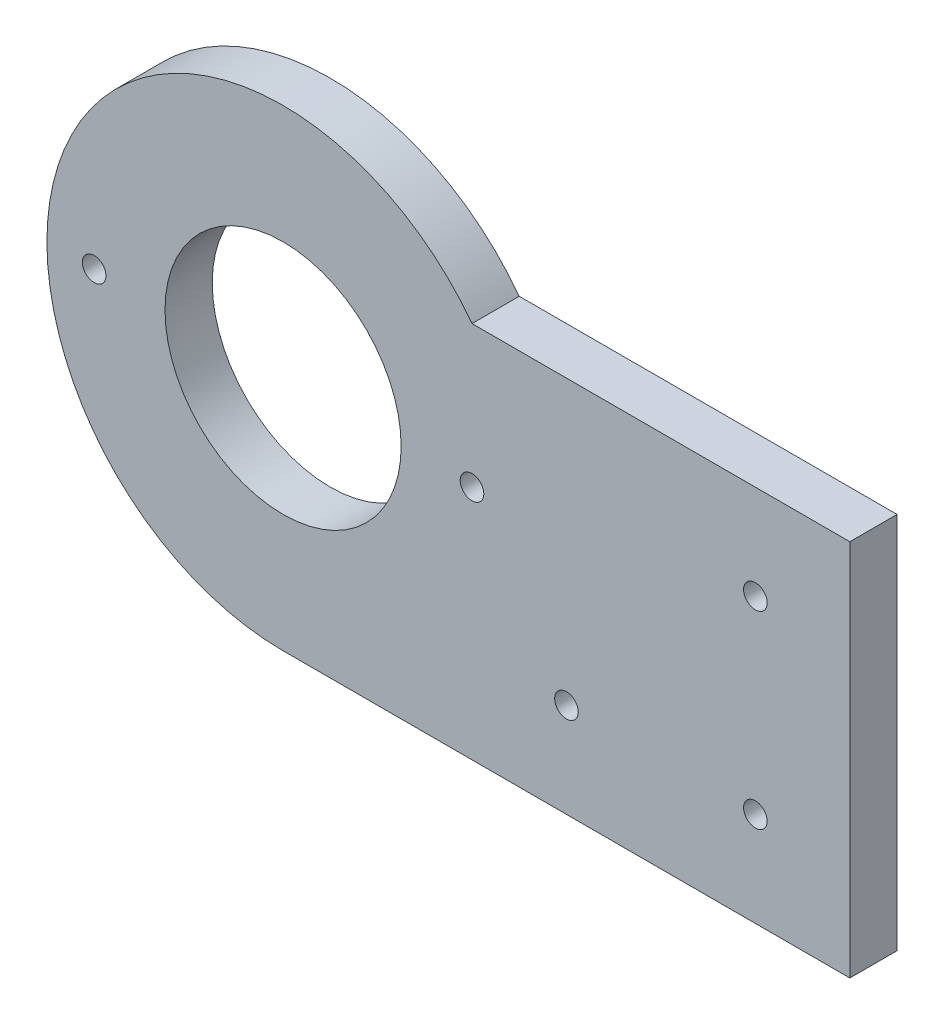
ISO-10303-21;
HEADER;
FILE_DESCRIPTION(('STEP AP214'),'2;1');
FILE_NAME('part.step','',(''),(''),'','','');
FILE_SCHEMA(('AUTOMOTIVE_DESIGN { 1 0 10303 214 1 1 1 1 }'));
ENDSEC;
DATA;
#1=APPLICATION_CONTEXT('core data for automotive mechanical design processes');
#2=APPLICATION_PROTOCOL_DEFINITION('international standard','automotive_design',2000,#1);
#3=PRODUCT_CONTEXT('',#1,'mechanical');
#4=PRODUCT('Part','Part','',(#3));
#5=PRODUCT_RELATED_PRODUCT_CATEGORY('part','',(#4));
#6=PRODUCT_DEFINITION_FORMATION('','',#4);
#7=PRODUCT_DEFINITION_CONTEXT('part definition',#1,'design');
#8=PRODUCT_DEFINITION('design','',#6,#7);
#9=PRODUCT_DEFINITION_SHAPE('','',#8);
#10=(LENGTH_UNIT() NAMED_UNIT(*) SI_UNIT(.MILLI.,.METRE.));
#11=(NAMED_UNIT(*) PLANE_ANGLE_UNIT() SI_UNIT($,.RADIAN.));
#12=(NAMED_UNIT(*) SI_UNIT($,.STERADIAN.) SOLID_ANGLE_UNIT());
#13=UNCERTAINTY_MEASURE_WITH_UNIT(LENGTH_MEASURE(1.E-05),#10,'distance_accuracy_value','');
#14=(GEOMETRIC_REPRESENTATION_CONTEXT(3) GLOBAL_UNCERTAINTY_ASSIGNED_CONTEXT((#13)) GLOBAL_UNIT_ASSIGNED_CONTEXT((#10,
#11,#12)) REPRESENTATION_CONTEXT('',''));
#15=CARTESIAN_POINT('',(0.,0.,0.));
#16=DIRECTION('',(0.,0.,1.));
#17=DIRECTION('',(1.,0.,0.));
#18=AXIS2_PLACEMENT_3D('',#15,#16,#17);
#19=CARTESIAN_POINT('',(0.,0.,6.35));
#20=DIRECTION('',(0.,0.,-1.));
#21=DIRECTION('',(-1.,0.,0.));
#22=AXIS2_PLACEMENT_3D('',#19,#20,#21);
#23=PLANE('',#22);
#24=DIRECTION('',(-1.,0.,0.));
#25=VECTOR('',#24,1.);
#26=CARTESIAN_POINT('',(76.2,19.05,6.35));
#27=LINE('',#26,#25);
#28=CARTESIAN_POINT('',(76.2,19.05,6.35));
#29=VERTEX_POINT('',#28);
#30=CARTESIAN_POINT('',(25.4,19.05,6.35));
#31=VERTEX_POINT('',#30);
#32=EDGE_CURVE('E103',#29,#31,#27,.T.);
#33=ORIENTED_EDGE('',*,*,#32,.T.);
#34=CARTESIAN_POINT('',(0.,0.,6.35));
#35=DIRECTION('',(0.,0.,1.));
#36=DIRECTION('',(-1.,0.,0.));
#37=AXIS2_PLACEMENT_3D('',#34,#35,#36);
#38=CIRCLE('',#37,31.75);
#39=CARTESIAN_POINT('',(0.,-31.75,6.35));
#40=VERTEX_POINT('',#39);
#41=EDGE_CURVE('E55',#31,#40,#38,.T.);
#42=ORIENTED_EDGE('',*,*,#41,.T.);
#43=DIRECTION('',(1.,0.,0.));
#44=VECTOR('',#43,1.);
#45=CARTESIAN_POINT('',(0.,-31.75,6.35));
#46=LINE('',#45,#44);
#47=CARTESIAN_POINT('',(76.2,-31.75,6.35));
#48=VERTEX_POINT('',#47);
#49=EDGE_CURVE('E156',#40,#48,#46,.T.);
#50=ORIENTED_EDGE('',*,*,#49,.T.);
#51=DIRECTION('',(0.,1.,0.));
#52=VECTOR('',#51,1.);
#53=CARTESIAN_POINT('',(76.2,-31.75,6.35));
#54=LINE('',#53,#52);
#55=EDGE_CURVE('E159',#48,#29,#54,.T.);
#56=ORIENTED_EDGE('',*,*,#55,.T.);
#57=EDGE_LOOP('',(#33,#42,#50,#56));
#58=FACE_BOUND('',#57,.T.);
#59=CARTESIAN_POINT('',(0.,0.,6.35));
#60=DIRECTION('',(0.,0.,1.));
#61=DIRECTION('',(1.,0.,0.));
#62=AXIS2_PLACEMENT_3D('',#59,#60,#61);
#63=CIRCLE('',#62,15.875);
#64=CARTESIAN_POINT('',(15.875,0.,6.35));
#65=VERTEX_POINT('',#64);
#66=EDGE_CURVE('E147',#65,#65,#63,.T.);
#67=ORIENTED_EDGE('',*,*,#66,.F.);
#68=EDGE_LOOP('',(#67));
#69=FACE_BOUND('',#68,.T.);
#70=CARTESIAN_POINT('',(-25.4,0.,6.35));
#71=DIRECTION('',(0.,0.,1.));
#72=DIRECTION('',(1.,0.,0.));
#73=AXIS2_PLACEMENT_3D('',#70,#71,#72);
#74=CIRCLE('',#73,1.5875);
#75=CARTESIAN_POINT('',(-23.8125,0.,6.35));
#76=VERTEX_POINT('',#75);
#77=EDGE_CURVE('E139',#76,#76,#74,.T.);
#78=ORIENTED_EDGE('',*,*,#77,.F.);
#79=EDGE_LOOP('',(#78));
#80=FACE_BOUND('',#79,.T.);
#81=CARTESIAN_POINT('',(25.4,0.,6.35));
#82=DIRECTION('',(0.,0.,1.));
#83=DIRECTION('',(1.,0.,0.));
#84=AXIS2_PLACEMENT_3D('',#81,#82,#83);
#85=CIRCLE('',#84,1.5875);
#86=CARTESIAN_POINT('',(26.9875,0.,6.35));
#87=VERTEX_POINT('',#86);
#88=EDGE_CURVE('E131',#87,#87,#85,.T.);
#89=ORIENTED_EDGE('',*,*,#88,.F.);
#90=EDGE_LOOP('',(#89));
#91=FACE_BOUND('',#90,.T.);
#92=CARTESIAN_POINT('',(38.1,-19.05,6.35));
#93=DIRECTION('',(0.,0.,1.));
#94=DIRECTION('',(1.,0.,0.));
#95=AXIS2_PLACEMENT_3D('',#92,#93,#94);
#96=CIRCLE('',#95,1.5875);
#97=CARTESIAN_POINT('',(39.6875,-19.05,6.35));
#98=VERTEX_POINT('',#97);
#99=EDGE_CURVE('E123',#98,#98,#96,.T.);
#100=ORIENTED_EDGE('',*,*,#99,.F.);
#101=EDGE_LOOP('',(#100));
#102=FACE_BOUND('',#101,.T.);
#103=CARTESIAN_POINT('',(63.5,-19.05,6.35));
#104=DIRECTION('',(0.,0.,1.));
#105=DIRECTION('',(1.,0.,0.));
#106=AXIS2_PLACEMENT_3D('',#103,#104,#105);
#107=CIRCLE('',#106,1.5875);
#108=CARTESIAN_POINT('',(65.0875,-19.05,6.35));
#109=VERTEX_POINT('',#108);
#110=EDGE_CURVE('E113',#109,#109,#107,.T.);
#111=ORIENTED_EDGE('',*,*,#110,.F.);
#112=EDGE_LOOP('',(#111));
#113=FACE_BOUND('',#112,.T.);
#114=CARTESIAN_POINT('',(63.5,6.35,6.35));
#115=DIRECTION('',(0.,0.,1.));
#116=DIRECTION('',(1.,0.,0.));
#117=AXIS2_PLACEMENT_3D('',#114,#115,#116);
#118=CIRCLE('',#117,1.5875);
#119=CARTESIAN_POINT('',(65.0875,6.35,6.35));
#120=VERTEX_POINT('',#119);
#121=EDGE_CURVE('E105',#120,#120,#118,.T.);
#122=ORIENTED_EDGE('',*,*,#121,.F.);
#123=EDGE_LOOP('',(#122));
#124=FACE_BOUND('',#123,.T.);
#125=ADVANCED_FACE('F39',(#58,#69,#80,#91,#102,#113,#124),#23,.F.);
#126=CARTESIAN_POINT('',(0.,0.,0.));
#127=DIRECTION('',(0.,0.,-1.));
#128=DIRECTION('',(-1.,0.,0.));
#129=AXIS2_PLACEMENT_3D('',#126,#127,#128);
#130=PLANE('',#129);
#131=CARTESIAN_POINT('',(0.,0.,0.));
#132=DIRECTION('',(0.,0.,1.));
#133=DIRECTION('',(-1.,0.,0.));
#134=AXIS2_PLACEMENT_3D('',#131,#132,#133);
#135=CIRCLE('',#134,31.75);
#136=CARTESIAN_POINT('',(25.4,19.05,0.));
#137=VERTEX_POINT('',#136);
#138=CARTESIAN_POINT('',(0.,-31.75,0.));
#139=VERTEX_POINT('',#138);
#140=EDGE_CURVE('E97',#137,#139,#135,.T.);
#141=ORIENTED_EDGE('',*,*,#140,.F.);
#142=DIRECTION('',(-1.,0.,0.));
#143=VECTOR('',#142,1.);
#144=CARTESIAN_POINT('',(76.2,19.05,0.));
#145=LINE('',#144,#143);
#146=CARTESIAN_POINT('',(76.2,19.05,0.));
#147=VERTEX_POINT('',#146);
#148=EDGE_CURVE('E94',#147,#137,#145,.T.);
#149=ORIENTED_EDGE('',*,*,#148,.F.);
#150=DIRECTION('',(0.,1.,0.));
#151=VECTOR('',#150,1.);
#152=CARTESIAN_POINT('',(76.2,-31.75,0.));
#153=LINE('',#152,#151);
#154=CARTESIAN_POINT('',(76.2,-31.75,0.));
#155=VERTEX_POINT('',#154);
#156=EDGE_CURVE('E80',#155,#147,#153,.T.);
#157=ORIENTED_EDGE('',*,*,#156,.F.);
#158=DIRECTION('',(1.,0.,0.));
#159=VECTOR('',#158,1.);
#160=CARTESIAN_POINT('',(0.,-31.75,0.));
#161=LINE('',#160,#159);
#162=EDGE_CURVE('E91',#139,#155,#161,.T.);
#163=ORIENTED_EDGE('',*,*,#162,.F.);
#164=EDGE_LOOP('',(#141,#149,#157,#163));
#165=FACE_BOUND('',#164,.T.);
#166=CARTESIAN_POINT('',(38.1,-19.05,0.));
#167=DIRECTION('',(0.,0.,1.));
#168=DIRECTION('',(1.,0.,0.));
#169=AXIS2_PLACEMENT_3D('',#166,#167,#168);
#170=CIRCLE('',#169,1.5875);
#171=CARTESIAN_POINT('',(39.6875,-19.05,0.));
#172=VERTEX_POINT('',#171);
#173=EDGE_CURVE('E117',#172,#172,#170,.T.);
#174=ORIENTED_EDGE('',*,*,#173,.T.);
#175=EDGE_LOOP('',(#174));
#176=FACE_BOUND('',#175,.T.);
#177=CARTESIAN_POINT('',(-25.4,0.,0.));
#178=DIRECTION('',(0.,0.,1.));
#179=DIRECTION('',(1.,0.,0.));
#180=AXIS2_PLACEMENT_3D('',#177,#178,#179);
#181=CIRCLE('',#180,1.5875);
#182=CARTESIAN_POINT('',(-23.8125,0.,0.));
#183=VERTEX_POINT('',#182);
#184=EDGE_CURVE('E135',#183,#183,#181,.T.);
#185=ORIENTED_EDGE('',*,*,#184,.T.);
#186=EDGE_LOOP('',(#185));
#187=FACE_BOUND('',#186,.T.);
#188=CARTESIAN_POINT('',(0.,0.,0.));
#189=DIRECTION('',(0.,0.,1.));
#190=DIRECTION('',(1.,0.,0.));
#191=AXIS2_PLACEMENT_3D('',#188,#189,#190);
#192=CIRCLE('',#191,15.875);
#193=CARTESIAN_POINT('',(15.875,0.,0.));
#194=VERTEX_POINT('',#193);
#195=EDGE_CURVE('E143',#194,#194,#192,.T.);
#196=ORIENTED_EDGE('',*,*,#195,.T.);
#197=EDGE_LOOP('',(#196));
#198=FACE_BOUND('',#197,.T.);
#199=CARTESIAN_POINT('',(25.4,0.,0.));
#200=DIRECTION('',(0.,0.,1.));
#201=DIRECTION('',(1.,0.,0.));
#202=AXIS2_PLACEMENT_3D('',#199,#200,#201);
#203=CIRCLE('',#202,1.5875);
#204=CARTESIAN_POINT('',(26.9875,0.,0.));
#205=VERTEX_POINT('',#204);
#206=EDGE_CURVE('E127',#205,#205,#203,.T.);
#207=ORIENTED_EDGE('',*,*,#206,.T.);
#208=EDGE_LOOP('',(#207));
#209=FACE_BOUND('',#208,.T.);
#210=CARTESIAN_POINT('',(63.5,-19.05,0.));
#211=DIRECTION('',(0.,0.,1.));
#212=DIRECTION('',(1.,0.,0.));
#213=AXIS2_PLACEMENT_3D('',#210,#211,#212);
#214=CIRCLE('',#213,1.5875);
#215=CARTESIAN_POINT('',(65.0875,-19.05,0.));
#216=VERTEX_POINT('',#215);
#217=EDGE_CURVE('E118',#216,#216,#214,.T.);
#218=ORIENTED_EDGE('',*,*,#217,.T.);
#219=EDGE_LOOP('',(#218));
#220=FACE_BOUND('',#219,.T.);
#221=CARTESIAN_POINT('',(63.5,6.35,0.));
#222=DIRECTION('',(0.,0.,-1.));
#223=DIRECTION('',(-1.,0.,0.));
#224=AXIS2_PLACEMENT_3D('',#221,#222,#223);
#225=CIRCLE('',#224,1.5875);
#226=CARTESIAN_POINT('',(61.9125,6.35,0.));
#227=VERTEX_POINT('',#226);
#228=EDGE_CURVE('E122',#227,#227,#225,.F.);
#229=ORIENTED_EDGE('',*,*,#228,.T.);
#230=EDGE_LOOP('',(#229));
#231=FACE_BOUND('',#230,.T.);
#232=ADVANCED_FACE('F95',(#165,#176,#187,#198,#209,#220,#231),#130,.T.);
#233=CARTESIAN_POINT('',(0.,0.,6.35));
#234=DIRECTION('',(0.,0.,-1.));
#235=DIRECTION('',(-1.,0.,0.));
#236=AXIS2_PLACEMENT_3D('',#233,#234,#235);
#237=CYLINDRICAL_SURFACE('',#236,31.75);
#238=ORIENTED_EDGE('',*,*,#41,.F.);
#239=DIRECTION('',(0.,0.,1.));
#240=VECTOR('',#239,1.);
#241=CARTESIAN_POINT('',(25.4,19.05,-56.7961266284947));
#242=LINE('',#241,#240);
#243=EDGE_CURVE('E59',#137,#31,#242,.T.);
#244=ORIENTED_EDGE('',*,*,#243,.F.);
#245=ORIENTED_EDGE('',*,*,#140,.T.);
#246=DIRECTION('',(0.,0.,-1.));
#247=VECTOR('',#246,1.);
#248=CARTESIAN_POINT('',(0.,-31.75,6.35));
#249=LINE('',#248,#247);
#250=EDGE_CURVE('E11',#40,#139,#249,.T.);
#251=ORIENTED_EDGE('',*,*,#250,.F.);
#252=EDGE_LOOP('',(#238,#244,#245,#251));
#253=FACE_BOUND('',#252,.T.);
#254=ADVANCED_FACE('F41',(#253),#237,.T.);
#255=CARTESIAN_POINT('',(0.,-31.75,6.35));
#256=DIRECTION('',(0.,1.,0.));
#257=DIRECTION('',(0.,0.,1.));
#258=AXIS2_PLACEMENT_3D('',#255,#256,#257);
#259=PLANE('',#258);
#260=ORIENTED_EDGE('',*,*,#162,.T.);
#261=DIRECTION('',(0.,0.,-1.));
#262=VECTOR('',#261,1.);
#263=CARTESIAN_POINT('',(76.2,-31.75,6.35));
#264=LINE('',#263,#262);
#265=EDGE_CURVE('E48',#48,#155,#264,.T.);
#266=ORIENTED_EDGE('',*,*,#265,.F.);
#267=ORIENTED_EDGE('',*,*,#49,.F.);
#268=ORIENTED_EDGE('',*,*,#250,.T.);
#269=EDGE_LOOP('',(#260,#266,#267,#268));
#270=FACE_BOUND('',#269,.T.);
#271=ADVANCED_FACE('F175',(#270),#259,.F.);
#272=CARTESIAN_POINT('',(76.2,-31.75,6.35));
#273=DIRECTION('',(-1.,0.,0.));
#274=DIRECTION('',(0.,0.,1.));
#275=AXIS2_PLACEMENT_3D('',#272,#273,#274);
#276=PLANE('',#275);
#277=ORIENTED_EDGE('',*,*,#156,.T.);
#278=DIRECTION('',(0.,0.,1.));
#279=VECTOR('',#278,1.);
#280=CARTESIAN_POINT('',(76.2,19.05,-56.7961266284947));
#281=LINE('',#280,#279);
#282=EDGE_CURVE('E85',#147,#29,#281,.T.);
#283=ORIENTED_EDGE('',*,*,#282,.T.);
#284=ORIENTED_EDGE('',*,*,#55,.F.);
#285=ORIENTED_EDGE('',*,*,#265,.T.);
#286=EDGE_LOOP('',(#277,#283,#284,#285));
#287=FACE_BOUND('',#286,.T.);
#288=ADVANCED_FACE('F82',(#287),#276,.F.);
#289=CARTESIAN_POINT('',(0.,0.,6.35));
#290=DIRECTION('',(0.,0.,-1.));
#291=DIRECTION('',(-1.,0.,0.));
#292=AXIS2_PLACEMENT_3D('',#289,#290,#291);
#293=CYLINDRICAL_SURFACE('',#292,15.875);
#294=ORIENTED_EDGE('',*,*,#66,.T.);
#295=EDGE_LOOP('',(#294));
#296=FACE_BOUND('',#295,.T.);
#297=ORIENTED_EDGE('',*,*,#195,.F.);
#298=EDGE_LOOP('',(#297));
#299=FACE_BOUND('',#298,.T.);
#300=ADVANCED_FACE('F187',(#296,#299),#293,.F.);
#301=CARTESIAN_POINT('',(-25.4,0.,6.35));
#302=DIRECTION('',(0.,0.,-1.));
#303=DIRECTION('',(-1.,0.,0.));
#304=AXIS2_PLACEMENT_3D('',#301,#302,#303);
#305=CYLINDRICAL_SURFACE('',#304,1.5875);
#306=ORIENTED_EDGE('',*,*,#77,.T.);
#307=EDGE_LOOP('',(#306));
#308=FACE_BOUND('',#307,.T.);
#309=ORIENTED_EDGE('',*,*,#184,.F.);
#310=EDGE_LOOP('',(#309));
#311=FACE_BOUND('',#310,.T.);
#312=ADVANCED_FACE('F194',(#308,#311),#305,.F.);
#313=CARTESIAN_POINT('',(25.4,0.,6.35));
#314=DIRECTION('',(0.,0.,-1.));
#315=DIRECTION('',(-1.,0.,0.));
#316=AXIS2_PLACEMENT_3D('',#313,#314,#315);
#317=CYLINDRICAL_SURFACE('',#316,1.5875);
#318=ORIENTED_EDGE('',*,*,#88,.T.);
#319=EDGE_LOOP('',(#318));
#320=FACE_BOUND('',#319,.T.);
#321=ORIENTED_EDGE('',*,*,#206,.F.);
#322=EDGE_LOOP('',(#321));
#323=FACE_BOUND('',#322,.T.);
#324=ADVANCED_FACE('F199',(#320,#323),#317,.F.);
#325=CARTESIAN_POINT('',(38.1,-19.05,6.35));
#326=DIRECTION('',(0.,0.,-1.));
#327=DIRECTION('',(-1.,0.,0.));
#328=AXIS2_PLACEMENT_3D('',#325,#326,#327);
#329=CYLINDRICAL_SURFACE('',#328,1.5875);
#330=ORIENTED_EDGE('',*,*,#99,.T.);
#331=EDGE_LOOP('',(#330));
#332=FACE_BOUND('',#331,.T.);
#333=ORIENTED_EDGE('',*,*,#173,.F.);
#334=EDGE_LOOP('',(#333));
#335=FACE_BOUND('',#334,.T.);
#336=ADVANCED_FACE('F224',(#332,#335),#329,.F.);
#337=CARTESIAN_POINT('',(63.5,-19.05,6.35));
#338=DIRECTION('',(0.,0.,-1.));
#339=DIRECTION('',(-1.,0.,0.));
#340=AXIS2_PLACEMENT_3D('',#337,#338,#339);
#341=CYLINDRICAL_SURFACE('',#340,1.5875);
#342=ORIENTED_EDGE('',*,*,#110,.T.);
#343=EDGE_LOOP('',(#342));
#344=FACE_BOUND('',#343,.T.);
#345=ORIENTED_EDGE('',*,*,#217,.F.);
#346=EDGE_LOOP('',(#345));
#347=FACE_BOUND('',#346,.T.);
#348=ADVANCED_FACE('F219',(#344,#347),#341,.F.);
#349=CARTESIAN_POINT('',(76.2,19.05,-56.7961266284947));
#350=DIRECTION('',(0.,1.,0.));
#351=DIRECTION('',(-1.,0.,0.));
#352=AXIS2_PLACEMENT_3D('',#349,#350,#351);
#353=PLANE('',#352);
#354=ORIENTED_EDGE('',*,*,#282,.F.);
#355=ORIENTED_EDGE('',*,*,#148,.T.);
#356=ORIENTED_EDGE('',*,*,#243,.T.);
#357=ORIENTED_EDGE('',*,*,#32,.F.);
#358=EDGE_LOOP('',(#354,#355,#356,#357));
#359=FACE_BOUND('',#358,.T.);
#360=ADVANCED_FACE('F101',(#359),#353,.T.);
#361=CARTESIAN_POINT('',(63.5,6.35,-56.7961266284947));
#362=DIRECTION('',(0.,0.,1.));
#363=DIRECTION('',(1.,0.,0.));
#364=AXIS2_PLACEMENT_3D('',#361,#362,#363);
#365=CYLINDRICAL_SURFACE('',#364,1.5875);
#366=ORIENTED_EDGE('',*,*,#121,.T.);
#367=EDGE_LOOP('',(#366));
#368=FACE_BOUND('',#367,.T.);
#369=ORIENTED_EDGE('',*,*,#228,.F.);
#370=EDGE_LOOP('',(#369));
#371=FACE_BOUND('',#370,.T.);
#372=ADVANCED_FACE('F212',(#368,#371),#365,.F.);
#373=CLOSED_SHELL('',(#125,#232,#254,#271,#288,#300,#312,#324,#336,#348,#360,#372));
#374=MANIFOLD_SOLID_BREP('B2',#373);
#375=ADVANCED_BREP_SHAPE_REPRESENTATION('',(#18,#374),#14);
#376=SHAPE_DEFINITION_REPRESENTATION(#9,#375);
ENDSEC;
END-ISO-10303-21;
